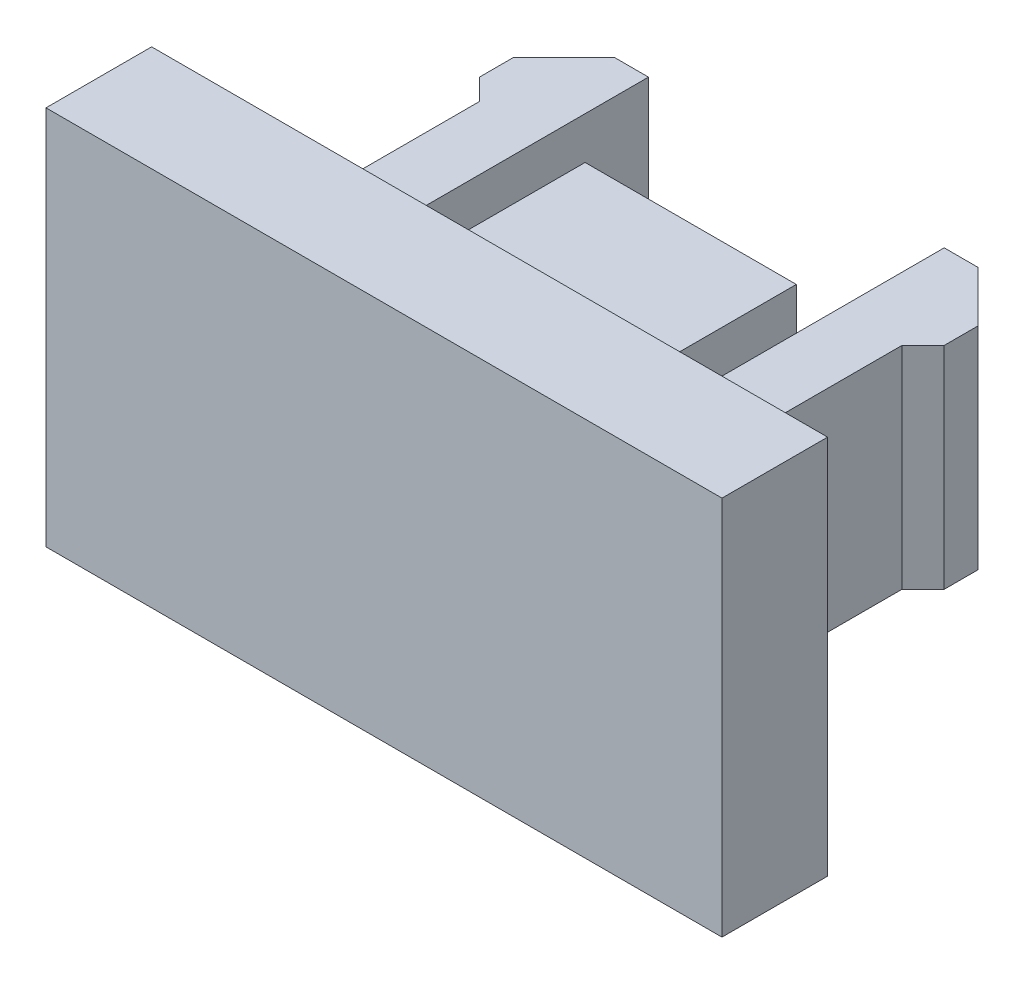
ISO-10303-21;
HEADER;
FILE_DESCRIPTION(('STEP AP214'),'2;1');
FILE_NAME('part.step','',(''),(''),'','','');
FILE_SCHEMA(('AUTOMOTIVE_DESIGN { 1 0 10303 214 1 1 1 1 }'));
ENDSEC;
DATA;
#1=APPLICATION_CONTEXT('core data for automotive mechanical design processes');
#2=APPLICATION_PROTOCOL_DEFINITION('international standard','automotive_design',2000,#1);
#3=PRODUCT_CONTEXT('',#1,'mechanical');
#4=PRODUCT('Part','Part','',(#3));
#5=PRODUCT_RELATED_PRODUCT_CATEGORY('part','',(#4));
#6=PRODUCT_DEFINITION_FORMATION('','',#4);
#7=PRODUCT_DEFINITION_CONTEXT('part definition',#1,'design');
#8=PRODUCT_DEFINITION('design','',#6,#7);
#9=PRODUCT_DEFINITION_SHAPE('','',#8);
#10=(LENGTH_UNIT() NAMED_UNIT(*) SI_UNIT(.MILLI.,.METRE.));
#11=(NAMED_UNIT(*) PLANE_ANGLE_UNIT() SI_UNIT($,.RADIAN.));
#12=(NAMED_UNIT(*) SI_UNIT($,.STERADIAN.) SOLID_ANGLE_UNIT());
#13=UNCERTAINTY_MEASURE_WITH_UNIT(LENGTH_MEASURE(1.E-05),#10,'distance_accuracy_value','');
#14=(GEOMETRIC_REPRESENTATION_CONTEXT(3) GLOBAL_UNCERTAINTY_ASSIGNED_CONTEXT((#13)) GLOBAL_UNIT_ASSIGNED_CONTEXT((#10,
#11,#12)) REPRESENTATION_CONTEXT('',''));
#15=CARTESIAN_POINT('',(0.,0.,0.));
#16=DIRECTION('',(0.,0.,1.));
#17=DIRECTION('',(1.,0.,0.));
#18=AXIS2_PLACEMENT_3D('',#15,#16,#17);
#19=CARTESIAN_POINT('',(0.,3.175,0.));
#20=DIRECTION('',(0.,1.,0.));
#21=DIRECTION('',(0.,0.,1.));
#22=AXIS2_PLACEMENT_3D('',#19,#20,#21);
#23=PLANE('',#22);
#24=DIRECTION('',(-1.,0.,0.));
#25=VECTOR('',#24,1.);
#26=CARTESIAN_POINT('',(0.,3.175,0.));
#27=LINE('',#26,#25);
#28=CARTESIAN_POINT('',(16.51,3.175,0.));
#29=VERTEX_POINT('',#28);
#30=CARTESIAN_POINT('',(14.605,3.175,0.));
#31=VERTEX_POINT('',#30);
#32=EDGE_CURVE('E310',#29,#31,#27,.T.);
#33=ORIENTED_EDGE('',*,*,#32,.F.);
#34=DIRECTION('',(0.,0.,-1.));
#35=VECTOR('',#34,1.);
#36=CARTESIAN_POINT('',(16.51,3.175,0.));
#37=LINE('',#36,#35);
#38=CARTESIAN_POINT('',(16.51,3.175,-6.0452));
#39=VERTEX_POINT('',#38);
#40=EDGE_CURVE('E359',#29,#39,#37,.T.);
#41=ORIENTED_EDGE('',*,*,#40,.T.);
#42=DIRECTION('',(0.707106781186547,0.,-0.707106781186548));
#43=VECTOR('',#42,1.);
#44=CARTESIAN_POINT('',(5.23240000000001,3.175,5.23240000000001));
#45=LINE('',#44,#43);
#46=CARTESIAN_POINT('',(17.145,3.175,-6.6802));
#47=VERTEX_POINT('',#46);
#48=EDGE_CURVE('E362',#39,#47,#45,.T.);
#49=ORIENTED_EDGE('',*,*,#48,.T.);
#50=DIRECTION('',(0.,0.,-1.));
#51=VECTOR('',#50,1.);
#52=CARTESIAN_POINT('',(17.145,3.175,0.));
#53=LINE('',#52,#51);
#54=CARTESIAN_POINT('',(17.145,3.175,-7.6962));
#55=VERTEX_POINT('',#54);
#56=EDGE_CURVE('E365',#47,#55,#53,.T.);
#57=ORIENTED_EDGE('',*,*,#56,.T.);
#58=DIRECTION('',(-0.707106781186548,0.,-0.707106781186547));
#59=VECTOR('',#58,1.);
#60=CARTESIAN_POINT('',(12.4206,3.175,-12.4206));
#61=LINE('',#60,#59);
#62=CARTESIAN_POINT('',(15.621,3.175,-9.2202));
#63=VERTEX_POINT('',#62);
#64=EDGE_CURVE('E368',#55,#63,#61,.T.);
#65=ORIENTED_EDGE('',*,*,#64,.T.);
#66=DIRECTION('',(-1.,0.,0.));
#67=VECTOR('',#66,1.);
#68=CARTESIAN_POINT('',(0.,3.175,-9.2202));
#69=LINE('',#68,#67);
#70=CARTESIAN_POINT('',(14.605,3.175,-9.2202));
#71=VERTEX_POINT('',#70);
#72=EDGE_CURVE('E371',#63,#71,#69,.T.);
#73=ORIENTED_EDGE('',*,*,#72,.T.);
#74=DIRECTION('',(0.,0.,1.));
#75=VECTOR('',#74,1.);
#76=CARTESIAN_POINT('',(14.605,3.175,0.));
#77=LINE('',#76,#75);
#78=EDGE_CURVE('E374',#71,#31,#77,.T.);
#79=ORIENTED_EDGE('',*,*,#78,.T.);
#80=EDGE_LOOP('',(#33,#41,#49,#57,#65,#73,#79));
#81=FACE_BOUND('',#80,.T.);
#82=ADVANCED_FACE('F47',(#81),#23,.T.);
#83=CARTESIAN_POINT('',(13.335,3.175,0.));
#84=VERTEX_POINT('',#83);
#85=CARTESIAN_POINT('',(6.985,3.175,0.));
#86=VERTEX_POINT('',#85);
#87=EDGE_CURVE('E311',#84,#86,#27,.T.);
#88=ORIENTED_EDGE('',*,*,#87,.F.);
#89=DIRECTION('',(0.,0.,1.));
#90=VECTOR('',#89,1.);
#91=CARTESIAN_POINT('',(13.335,3.175,-6.0452));
#92=LINE('',#91,#90);
#93=CARTESIAN_POINT('',(13.335,3.175,-6.0452));
#94=VERTEX_POINT('',#93);
#95=EDGE_CURVE('E328',#94,#84,#92,.T.);
#96=ORIENTED_EDGE('',*,*,#95,.F.);
#97=DIRECTION('',(1.,0.,0.));
#98=VECTOR('',#97,1.);
#99=CARTESIAN_POINT('',(0.,3.175,-6.0452));
#100=LINE('',#99,#98);
#101=CARTESIAN_POINT('',(6.985,3.175,-6.0452));
#102=VERTEX_POINT('',#101);
#103=EDGE_CURVE('E378',#102,#94,#100,.T.);
#104=ORIENTED_EDGE('',*,*,#103,.F.);
#105=DIRECTION('',(0.,0.,-1.));
#106=VECTOR('',#105,1.);
#107=CARTESIAN_POINT('',(6.985,3.175,-6.0452));
#108=LINE('',#107,#106);
#109=EDGE_CURVE('E324',#86,#102,#108,.T.);
#110=ORIENTED_EDGE('',*,*,#109,.F.);
#111=EDGE_LOOP('',(#88,#96,#104,#110));
#112=FACE_BOUND('',#111,.T.);
#113=ADVANCED_FACE('F402',(#112),#23,.T.);
#114=CARTESIAN_POINT('',(0.,-3.175,0.));
#115=DIRECTION('',(0.,1.,0.));
#116=DIRECTION('',(0.,0.,1.));
#117=AXIS2_PLACEMENT_3D('',#114,#115,#116);
#118=PLANE('',#117);
#119=DIRECTION('',(0.,0.,-1.));
#120=VECTOR('',#119,1.);
#121=CARTESIAN_POINT('',(16.51,-3.175,0.));
#122=LINE('',#121,#120);
#123=CARTESIAN_POINT('',(16.51,-3.175,0.));
#124=VERTEX_POINT('',#123);
#125=CARTESIAN_POINT('',(16.51,-3.175,-6.0452));
#126=VERTEX_POINT('',#125);
#127=EDGE_CURVE('E173',#124,#126,#122,.T.);
#128=ORIENTED_EDGE('',*,*,#127,.F.);
#129=DIRECTION('',(-1.,0.,0.));
#130=VECTOR('',#129,1.);
#131=CARTESIAN_POINT('',(0.,-3.175,0.));
#132=LINE('',#131,#130);
#133=CARTESIAN_POINT('',(14.605,-3.175,0.));
#134=VERTEX_POINT('',#133);
#135=EDGE_CURVE('E306',#124,#134,#132,.T.);
#136=ORIENTED_EDGE('',*,*,#135,.T.);
#137=DIRECTION('',(0.,0.,1.));
#138=VECTOR('',#137,1.);
#139=CARTESIAN_POINT('',(14.605,-3.175,0.));
#140=LINE('',#139,#138);
#141=CARTESIAN_POINT('',(14.605,-3.175,-9.2202));
#142=VERTEX_POINT('',#141);
#143=EDGE_CURVE('E189',#142,#134,#140,.T.);
#144=ORIENTED_EDGE('',*,*,#143,.F.);
#145=DIRECTION('',(-1.,0.,0.));
#146=VECTOR('',#145,1.);
#147=CARTESIAN_POINT('',(0.,-3.175,-9.2202));
#148=LINE('',#147,#146);
#149=CARTESIAN_POINT('',(15.621,-3.175,-9.2202));
#150=VERTEX_POINT('',#149);
#151=EDGE_CURVE('E186',#150,#142,#148,.T.);
#152=ORIENTED_EDGE('',*,*,#151,.F.);
#153=DIRECTION('',(-0.707106781186548,0.,-0.707106781186547));
#154=VECTOR('',#153,1.);
#155=CARTESIAN_POINT('',(12.4206,-3.175,-12.4206));
#156=LINE('',#155,#154);
#157=CARTESIAN_POINT('',(17.145,-3.175,-7.6962));
#158=VERTEX_POINT('',#157);
#159=EDGE_CURVE('E183',#158,#150,#156,.T.);
#160=ORIENTED_EDGE('',*,*,#159,.F.);
#161=DIRECTION('',(0.,0.,-1.));
#162=VECTOR('',#161,1.);
#163=CARTESIAN_POINT('',(17.145,-3.175,0.));
#164=LINE('',#163,#162);
#165=CARTESIAN_POINT('',(17.145,-3.175,-6.6802));
#166=VERTEX_POINT('',#165);
#167=EDGE_CURVE('E180',#166,#158,#164,.T.);
#168=ORIENTED_EDGE('',*,*,#167,.F.);
#169=DIRECTION('',(0.707106781186547,0.,-0.707106781186548));
#170=VECTOR('',#169,1.);
#171=CARTESIAN_POINT('',(5.23240000000001,-3.175,5.23240000000001));
#172=LINE('',#171,#170);
#173=EDGE_CURVE('E177',#126,#166,#172,.T.);
#174=ORIENTED_EDGE('',*,*,#173,.F.);
#175=EDGE_LOOP('',(#128,#136,#144,#152,#160,#168,#174));
#176=FACE_BOUND('',#175,.T.);
#177=ADVANCED_FACE('F410',(#176),#118,.F.);
#178=DIRECTION('',(0.,0.,1.));
#179=VECTOR('',#178,1.);
#180=CARTESIAN_POINT('',(13.335,-3.175,-6.0452));
#181=LINE('',#180,#179);
#182=CARTESIAN_POINT('',(13.335,-3.175,-6.0452));
#183=VERTEX_POINT('',#182);
#184=CARTESIAN_POINT('',(13.335,-3.175,0.));
#185=VERTEX_POINT('',#184);
#186=EDGE_CURVE('E343',#183,#185,#181,.T.);
#187=ORIENTED_EDGE('',*,*,#186,.T.);
#188=CARTESIAN_POINT('',(6.985,-3.175,0.));
#189=VERTEX_POINT('',#188);
#190=EDGE_CURVE('E312',#185,#189,#132,.T.);
#191=ORIENTED_EDGE('',*,*,#190,.T.);
#192=DIRECTION('',(0.,0.,-1.));
#193=VECTOR('',#192,1.);
#194=CARTESIAN_POINT('',(6.985,-3.175,-6.0452));
#195=LINE('',#194,#193);
#196=CARTESIAN_POINT('',(6.985,-3.175,-6.0452));
#197=VERTEX_POINT('',#196);
#198=EDGE_CURVE('E319',#189,#197,#195,.T.);
#199=ORIENTED_EDGE('',*,*,#198,.T.);
#200=DIRECTION('',(1.,0.,0.));
#201=VECTOR('',#200,1.);
#202=CARTESIAN_POINT('',(0.,-3.175,-6.0452));
#203=LINE('',#202,#201);
#204=EDGE_CURVE('E193',#197,#183,#203,.T.);
#205=ORIENTED_EDGE('',*,*,#204,.T.);
#206=EDGE_LOOP('',(#187,#191,#199,#205));
#207=FACE_BOUND('',#206,.T.);
#208=ADVANCED_FACE('F416',(#207),#118,.F.);
#209=CARTESIAN_POINT('',(3.81,3.175,0.));
#210=DIRECTION('',(-1.,0.,0.));
#211=DIRECTION('',(0.,0.,1.));
#212=AXIS2_PLACEMENT_3D('',#209,#210,#211);
#213=PLANE('',#212);
#214=DIRECTION('',(0.,0.,-1.));
#215=VECTOR('',#214,1.);
#216=CARTESIAN_POINT('',(3.81,-3.175,0.));
#217=LINE('',#216,#215);
#218=CARTESIAN_POINT('',(3.81,-3.175,0.));
#219=VERTEX_POINT('',#218);
#220=CARTESIAN_POINT('',(3.81,-3.175,-6.0452));
#221=VERTEX_POINT('',#220);
#222=EDGE_CURVE('E170',#219,#221,#217,.T.);
#223=ORIENTED_EDGE('',*,*,#222,.F.);
#224=DIRECTION('',(0.,-1.,0.));
#225=VECTOR('',#224,1.);
#226=CARTESIAN_POINT('',(3.81,3.175,0.));
#227=LINE('',#226,#225);
#228=CARTESIAN_POINT('',(3.81,3.175,0.));
#229=VERTEX_POINT('',#228);
#230=EDGE_CURVE('E11',#229,#219,#227,.T.);
#231=ORIENTED_EDGE('',*,*,#230,.F.);
#232=DIRECTION('',(0.,0.,-1.));
#233=VECTOR('',#232,1.);
#234=CARTESIAN_POINT('',(3.81,3.175,0.));
#235=LINE('',#234,#233);
#236=CARTESIAN_POINT('',(3.81,3.175,-6.0452));
#237=VERTEX_POINT('',#236);
#238=EDGE_CURVE('E214',#229,#237,#235,.T.);
#239=ORIENTED_EDGE('',*,*,#238,.T.);
#240=DIRECTION('',(0.,-1.,0.));
#241=VECTOR('',#240,1.);
#242=CARTESIAN_POINT('',(3.81,3.175,-6.0452));
#243=LINE('',#242,#241);
#244=EDGE_CURVE('E65',#237,#221,#243,.T.);
#245=ORIENTED_EDGE('',*,*,#244,.T.);
#246=EDGE_LOOP('',(#223,#231,#239,#245));
#247=FACE_BOUND('',#246,.T.);
#248=ADVANCED_FACE('F49',(#247),#213,.T.);
#249=CARTESIAN_POINT('',(0.,3.175,0.));
#250=DIRECTION('',(1.,0.,0.));
#251=DIRECTION('',(0.,0.,-1.));
#252=AXIS2_PLACEMENT_3D('',#249,#250,#251);
#253=PLANE('',#252);
#254=DIRECTION('',(0.,-1.,0.));
#255=VECTOR('',#254,1.);
#256=CARTESIAN_POINT('',(0.,3.175,0.));
#257=LINE('',#256,#255);
#258=CARTESIAN_POINT('',(0.,5.715,0.));
#259=VERTEX_POINT('',#258);
#260=CARTESIAN_POINT('',(0.,-5.715,0.));
#261=VERTEX_POINT('',#260);
#262=EDGE_CURVE('E57',#259,#261,#257,.T.);
#263=ORIENTED_EDGE('',*,*,#262,.T.);
#264=DIRECTION('',(0.,0.,1.));
#265=VECTOR('',#264,1.);
#266=CARTESIAN_POINT('',(0.,-5.715,0.));
#267=LINE('',#266,#265);
#268=CARTESIAN_POINT('',(0.,-5.715,3.175));
#269=VERTEX_POINT('',#268);
#270=EDGE_CURVE('E270',#261,#269,#267,.T.);
#271=ORIENTED_EDGE('',*,*,#270,.T.);
#272=DIRECTION('',(0.,-1.,0.));
#273=VECTOR('',#272,1.);
#274=CARTESIAN_POINT('',(0.,3.175,3.175));
#275=LINE('',#274,#273);
#276=CARTESIAN_POINT('',(0.,5.715,3.175));
#277=VERTEX_POINT('',#276);
#278=EDGE_CURVE('E256',#277,#269,#275,.T.);
#279=ORIENTED_EDGE('',*,*,#278,.F.);
#280=DIRECTION('',(0.,0.,1.));
#281=VECTOR('',#280,1.);
#282=CARTESIAN_POINT('',(0.,5.715,0.));
#283=LINE('',#282,#281);
#284=EDGE_CURVE('E274',#259,#277,#283,.T.);
#285=ORIENTED_EDGE('',*,*,#284,.F.);
#286=EDGE_LOOP('',(#263,#271,#279,#285));
#287=FACE_BOUND('',#286,.T.);
#288=ADVANCED_FACE('F267',(#287),#253,.F.);
#289=CARTESIAN_POINT('',(0.,3.175,3.175));
#290=DIRECTION('',(0.,0.,-1.));
#291=DIRECTION('',(-1.,0.,0.));
#292=AXIS2_PLACEMENT_3D('',#289,#290,#291);
#293=PLANE('',#292);
#294=ORIENTED_EDGE('',*,*,#278,.T.);
#295=DIRECTION('',(1.,0.,0.));
#296=VECTOR('',#295,1.);
#297=CARTESIAN_POINT('',(0.,-5.715,3.175));
#298=LINE('',#297,#296);
#299=CARTESIAN_POINT('',(20.32,-5.715,3.175));
#300=VERTEX_POINT('',#299);
#301=EDGE_CURVE('E287',#269,#300,#298,.T.);
#302=ORIENTED_EDGE('',*,*,#301,.T.);
#303=DIRECTION('',(0.,-1.,0.));
#304=VECTOR('',#303,1.);
#305=CARTESIAN_POINT('',(20.32,3.175,3.175));
#306=LINE('',#305,#304);
#307=CARTESIAN_POINT('',(20.32,5.715,3.175));
#308=VERTEX_POINT('',#307);
#309=EDGE_CURVE('E252',#308,#300,#306,.T.);
#310=ORIENTED_EDGE('',*,*,#309,.F.);
#311=DIRECTION('',(1.,0.,0.));
#312=VECTOR('',#311,1.);
#313=CARTESIAN_POINT('',(0.,5.715,3.175));
#314=LINE('',#313,#312);
#315=EDGE_CURVE('E474',#277,#308,#314,.T.);
#316=ORIENTED_EDGE('',*,*,#315,.F.);
#317=EDGE_LOOP('',(#294,#302,#310,#316));
#318=FACE_BOUND('',#317,.T.);
#319=ADVANCED_FACE('F518',(#318),#293,.F.);
#320=CARTESIAN_POINT('',(20.32,3.175,0.));
#321=DIRECTION('',(-1.,0.,0.));
#322=DIRECTION('',(0.,0.,1.));
#323=AXIS2_PLACEMENT_3D('',#320,#321,#322);
#324=PLANE('',#323);
#325=ORIENTED_EDGE('',*,*,#309,.T.);
#326=DIRECTION('',(0.,0.,-1.));
#327=VECTOR('',#326,1.);
#328=CARTESIAN_POINT('',(20.32,-5.715,0.));
#329=LINE('',#328,#327);
#330=CARTESIAN_POINT('',(20.32,-5.715,0.));
#331=VERTEX_POINT('',#330);
#332=EDGE_CURVE('E302',#300,#331,#329,.T.);
#333=ORIENTED_EDGE('',*,*,#332,.T.);
#334=DIRECTION('',(0.,-1.,0.));
#335=VECTOR('',#334,1.);
#336=CARTESIAN_POINT('',(20.32,3.175,0.));
#337=LINE('',#336,#335);
#338=CARTESIAN_POINT('',(20.32,5.715,0.));
#339=VERTEX_POINT('',#338);
#340=EDGE_CURVE('E248',#339,#331,#337,.T.);
#341=ORIENTED_EDGE('',*,*,#340,.F.);
#342=DIRECTION('',(0.,0.,-1.));
#343=VECTOR('',#342,1.);
#344=CARTESIAN_POINT('',(20.32,5.715,0.));
#345=LINE('',#344,#343);
#346=EDGE_CURVE('E297',#308,#339,#345,.T.);
#347=ORIENTED_EDGE('',*,*,#346,.F.);
#348=EDGE_LOOP('',(#325,#333,#341,#347));
#349=FACE_BOUND('',#348,.T.);
#350=ADVANCED_FACE('F509',(#349),#324,.F.);
#351=CARTESIAN_POINT('',(0.,3.175,0.));
#352=DIRECTION('',(0.,0.,-1.));
#353=DIRECTION('',(-1.,0.,0.));
#354=AXIS2_PLACEMENT_3D('',#351,#352,#353);
#355=PLANE('',#354);
#356=DIRECTION('',(1.,0.,0.));
#357=VECTOR('',#356,1.);
#358=CARTESIAN_POINT('',(0.,5.715,0.));
#359=LINE('',#358,#357);
#360=EDGE_CURVE('E305',#259,#339,#359,.T.);
#361=ORIENTED_EDGE('',*,*,#360,.T.);
#362=ORIENTED_EDGE('',*,*,#340,.T.);
#363=DIRECTION('',(1.,0.,0.));
#364=VECTOR('',#363,1.);
#365=CARTESIAN_POINT('',(0.,-5.715,0.));
#366=LINE('',#365,#364);
#367=EDGE_CURVE('E285',#261,#331,#366,.T.);
#368=ORIENTED_EDGE('',*,*,#367,.F.);
#369=ORIENTED_EDGE('',*,*,#262,.F.);
#370=EDGE_LOOP('',(#361,#362,#368,#369));
#371=FACE_BOUND('',#370,.T.);
#372=ORIENTED_EDGE('',*,*,#32,.T.);
#373=DIRECTION('',(0.,1.,0.));
#374=VECTOR('',#373,1.);
#375=CARTESIAN_POINT('',(14.605,-3.175,0.));
#376=LINE('',#375,#374);
#377=EDGE_CURVE('E317',#134,#31,#376,.T.);
#378=ORIENTED_EDGE('',*,*,#377,.F.);
#379=ORIENTED_EDGE('',*,*,#135,.F.);
#380=DIRECTION('',(0.,-1.,0.));
#381=VECTOR('',#380,1.);
#382=CARTESIAN_POINT('',(16.51,3.175,0.));
#383=LINE('',#382,#381);
#384=EDGE_CURVE('E244',#29,#124,#383,.T.);
#385=ORIENTED_EDGE('',*,*,#384,.F.);
#386=EDGE_LOOP('',(#372,#378,#379,#385));
#387=FACE_BOUND('',#386,.T.);
#388=ORIENTED_EDGE('',*,*,#87,.T.);
#389=DIRECTION('',(0.,1.,0.));
#390=VECTOR('',#389,1.);
#391=CARTESIAN_POINT('',(6.985,-3.175,0.));
#392=LINE('',#391,#390);
#393=EDGE_CURVE('E332',#189,#86,#392,.T.);
#394=ORIENTED_EDGE('',*,*,#393,.F.);
#395=ORIENTED_EDGE('',*,*,#190,.F.);
#396=DIRECTION('',(0.,1.,0.));
#397=VECTOR('',#396,1.);
#398=CARTESIAN_POINT('',(13.335,-3.175,0.));
#399=LINE('',#398,#397);
#400=EDGE_CURVE('E344',#185,#84,#399,.T.);
#401=ORIENTED_EDGE('',*,*,#400,.T.);
#402=EDGE_LOOP('',(#388,#394,#395,#401));
#403=FACE_BOUND('',#402,.T.);
#404=DIRECTION('',(0.,1.,0.));
#405=VECTOR('',#404,1.);
#406=CARTESIAN_POINT('',(5.715,-3.175,0.));
#407=LINE('',#406,#405);
#408=CARTESIAN_POINT('',(5.715,-3.175,0.));
#409=VERTEX_POINT('',#408);
#410=CARTESIAN_POINT('',(5.715,3.175,0.));
#411=VERTEX_POINT('',#410);
#412=EDGE_CURVE('E323',#409,#411,#407,.T.);
#413=ORIENTED_EDGE('',*,*,#412,.T.);
#414=EDGE_CURVE('E318',#411,#229,#27,.T.);
#415=ORIENTED_EDGE('',*,*,#414,.T.);
#416=ORIENTED_EDGE('',*,*,#230,.T.);
#417=EDGE_CURVE('E313',#409,#219,#132,.T.);
#418=ORIENTED_EDGE('',*,*,#417,.F.);
#419=EDGE_LOOP('',(#413,#415,#416,#418));
#420=FACE_BOUND('',#419,.T.);
#421=ADVANCED_FACE('F290',(#371,#387,#403,#420),#355,.T.);
#422=CARTESIAN_POINT('',(16.51,3.175,0.));
#423=DIRECTION('',(-1.,0.,0.));
#424=DIRECTION('',(0.,0.,1.));
#425=AXIS2_PLACEMENT_3D('',#422,#423,#424);
#426=PLANE('',#425);
#427=ORIENTED_EDGE('',*,*,#127,.T.);
#428=DIRECTION('',(0.,-1.,0.));
#429=VECTOR('',#428,1.);
#430=CARTESIAN_POINT('',(16.51,3.175,-6.0452));
#431=LINE('',#430,#429);
#432=EDGE_CURVE('E240',#39,#126,#431,.T.);
#433=ORIENTED_EDGE('',*,*,#432,.F.);
#434=ORIENTED_EDGE('',*,*,#40,.F.);
#435=ORIENTED_EDGE('',*,*,#384,.T.);
#436=EDGE_LOOP('',(#427,#433,#434,#435));
#437=FACE_BOUND('',#436,.T.);
#438=ADVANCED_FACE('F508',(#437),#426,.F.);
#439=CARTESIAN_POINT('',(5.23240000000001,3.175,5.23240000000001));
#440=DIRECTION('',(-0.707106781186548,0.,-0.707106781186547));
#441=DIRECTION('',(-0.707106781186547,0.,0.707106781186548));
#442=AXIS2_PLACEMENT_3D('',#439,#440,#441);
#443=PLANE('',#442);
#444=ORIENTED_EDGE('',*,*,#173,.T.);
#445=DIRECTION('',(0.,-1.,0.));
#446=VECTOR('',#445,1.);
#447=CARTESIAN_POINT('',(17.145,3.175,-6.6802));
#448=LINE('',#447,#446);
#449=EDGE_CURVE('E236',#47,#166,#448,.T.);
#450=ORIENTED_EDGE('',*,*,#449,.F.);
#451=ORIENTED_EDGE('',*,*,#48,.F.);
#452=ORIENTED_EDGE('',*,*,#432,.T.);
#453=EDGE_LOOP('',(#444,#450,#451,#452));
#454=FACE_BOUND('',#453,.T.);
#455=ADVANCED_FACE('F515',(#454),#443,.F.);
#456=CARTESIAN_POINT('',(17.145,3.175,0.));
#457=DIRECTION('',(-1.,0.,0.));
#458=DIRECTION('',(0.,0.,1.));
#459=AXIS2_PLACEMENT_3D('',#456,#457,#458);
#460=PLANE('',#459);
#461=ORIENTED_EDGE('',*,*,#167,.T.);
#462=DIRECTION('',(0.,-1.,0.));
#463=VECTOR('',#462,1.);
#464=CARTESIAN_POINT('',(17.145,3.175,-7.6962));
#465=LINE('',#464,#463);
#466=EDGE_CURVE('E232',#55,#158,#465,.T.);
#467=ORIENTED_EDGE('',*,*,#466,.F.);
#468=ORIENTED_EDGE('',*,*,#56,.F.);
#469=ORIENTED_EDGE('',*,*,#449,.T.);
#470=EDGE_LOOP('',(#461,#467,#468,#469));
#471=FACE_BOUND('',#470,.T.);
#472=ADVANCED_FACE('F680',(#471),#460,.F.);
#473=CARTESIAN_POINT('',(12.4206,3.175,-12.4206));
#474=DIRECTION('',(-0.707106781186547,0.,0.707106781186548));
#475=DIRECTION('',(0.707106781186548,0.,0.707106781186547));
#476=AXIS2_PLACEMENT_3D('',#473,#474,#475);
#477=PLANE('',#476);
#478=ORIENTED_EDGE('',*,*,#159,.T.);
#479=DIRECTION('',(0.,-1.,0.));
#480=VECTOR('',#479,1.);
#481=CARTESIAN_POINT('',(15.621,3.175,-9.2202));
#482=LINE('',#481,#480);
#483=EDGE_CURVE('E228',#63,#150,#482,.T.);
#484=ORIENTED_EDGE('',*,*,#483,.F.);
#485=ORIENTED_EDGE('',*,*,#64,.F.);
#486=ORIENTED_EDGE('',*,*,#466,.T.);
#487=EDGE_LOOP('',(#478,#484,#485,#486));
#488=FACE_BOUND('',#487,.T.);
#489=ADVANCED_FACE('F671',(#488),#477,.F.);
#490=CARTESIAN_POINT('',(0.,3.175,-9.2202));
#491=DIRECTION('',(0.,0.,1.));
#492=DIRECTION('',(1.,0.,0.));
#493=AXIS2_PLACEMENT_3D('',#490,#491,#492);
#494=PLANE('',#493);
#495=ORIENTED_EDGE('',*,*,#151,.T.);
#496=DIRECTION('',(0.,-1.,0.));
#497=VECTOR('',#496,1.);
#498=CARTESIAN_POINT('',(14.605,3.175,-9.2202));
#499=LINE('',#498,#497);
#500=EDGE_CURVE('E224',#71,#142,#499,.T.);
#501=ORIENTED_EDGE('',*,*,#500,.F.);
#502=ORIENTED_EDGE('',*,*,#72,.F.);
#503=ORIENTED_EDGE('',*,*,#483,.T.);
#504=EDGE_LOOP('',(#495,#501,#502,#503));
#505=FACE_BOUND('',#504,.T.);
#506=ADVANCED_FACE('F608',(#505),#494,.F.);
#507=CARTESIAN_POINT('',(14.605,3.175,0.));
#508=DIRECTION('',(1.,0.,0.));
#509=DIRECTION('',(0.,0.,-1.));
#510=AXIS2_PLACEMENT_3D('',#507,#508,#509);
#511=PLANE('',#510);
#512=ORIENTED_EDGE('',*,*,#143,.T.);
#513=ORIENTED_EDGE('',*,*,#377,.T.);
#514=ORIENTED_EDGE('',*,*,#78,.F.);
#515=ORIENTED_EDGE('',*,*,#500,.T.);
#516=EDGE_LOOP('',(#512,#513,#514,#515));
#517=FACE_BOUND('',#516,.T.);
#518=ADVANCED_FACE('F604',(#517),#511,.F.);
#519=CARTESIAN_POINT('',(0.,3.175,-6.0452));
#520=DIRECTION('',(0.,0.,-1.));
#521=DIRECTION('',(-1.,0.,0.));
#522=AXIS2_PLACEMENT_3D('',#519,#520,#521);
#523=PLANE('',#522);
#524=DIRECTION('',(0.,1.,0.));
#525=VECTOR('',#524,1.);
#526=CARTESIAN_POINT('',(6.985,-3.175,-6.0452));
#527=LINE('',#526,#525);
#528=EDGE_CURVE('E174',#197,#102,#527,.T.);
#529=ORIENTED_EDGE('',*,*,#528,.T.);
#530=ORIENTED_EDGE('',*,*,#103,.T.);
#531=DIRECTION('',(0.,1.,0.));
#532=VECTOR('',#531,1.);
#533=CARTESIAN_POINT('',(13.335,-3.175,-6.0452));
#534=LINE('',#533,#532);
#535=EDGE_CURVE('E339',#183,#94,#534,.T.);
#536=ORIENTED_EDGE('',*,*,#535,.F.);
#537=ORIENTED_EDGE('',*,*,#204,.F.);
#538=EDGE_LOOP('',(#529,#530,#536,#537));
#539=FACE_BOUND('',#538,.T.);
#540=ADVANCED_FACE('F446',(#539),#523,.T.);
#541=CARTESIAN_POINT('',(5.715,3.175,0.));
#542=DIRECTION('',(1.,0.,0.));
#543=DIRECTION('',(0.,0.,-1.));
#544=AXIS2_PLACEMENT_3D('',#541,#542,#543);
#545=PLANE('',#544);
#546=DIRECTION('',(0.,0.,1.));
#547=VECTOR('',#546,1.);
#548=CARTESIAN_POINT('',(5.715,-3.175,0.));
#549=LINE('',#548,#547);
#550=CARTESIAN_POINT('',(5.715,-3.175,-9.2202));
#551=VERTEX_POINT('',#550);
#552=EDGE_CURVE('E197',#551,#409,#549,.T.);
#553=ORIENTED_EDGE('',*,*,#552,.F.);
#554=DIRECTION('',(0.,-1.,0.));
#555=VECTOR('',#554,1.);
#556=CARTESIAN_POINT('',(5.715,3.175,-9.2202));
#557=LINE('',#556,#555);
#558=CARTESIAN_POINT('',(5.715,3.175,-9.2202));
#559=VERTEX_POINT('',#558);
#560=EDGE_CURVE('E221',#559,#551,#557,.T.);
#561=ORIENTED_EDGE('',*,*,#560,.F.);
#562=DIRECTION('',(0.,0.,1.));
#563=VECTOR('',#562,1.);
#564=CARTESIAN_POINT('',(5.715,3.175,0.));
#565=LINE('',#564,#563);
#566=EDGE_CURVE('E382',#559,#411,#565,.T.);
#567=ORIENTED_EDGE('',*,*,#566,.T.);
#568=ORIENTED_EDGE('',*,*,#412,.F.);
#569=EDGE_LOOP('',(#553,#561,#567,#568));
#570=FACE_BOUND('',#569,.T.);
#571=ADVANCED_FACE('F506',(#570),#545,.T.);
#572=CARTESIAN_POINT('',(0.,3.175,-9.2202));
#573=DIRECTION('',(0.,0.,-1.));
#574=DIRECTION('',(-1.,0.,0.));
#575=AXIS2_PLACEMENT_3D('',#572,#573,#574);
#576=PLANE('',#575);
#577=DIRECTION('',(1.,0.,0.));
#578=VECTOR('',#577,1.);
#579=CARTESIAN_POINT('',(0.,-3.175,-9.2202));
#580=LINE('',#579,#578);
#581=CARTESIAN_POINT('',(4.699,-3.175,-9.2202));
#582=VERTEX_POINT('',#581);
#583=EDGE_CURVE('E201',#582,#551,#580,.T.);
#584=ORIENTED_EDGE('',*,*,#583,.F.);
#585=DIRECTION('',(0.,-1.,0.));
#586=VECTOR('',#585,1.);
#587=CARTESIAN_POINT('',(4.699,3.175,-9.2202));
#588=LINE('',#587,#586);
#589=CARTESIAN_POINT('',(4.699,3.175,-9.2202));
#590=VERTEX_POINT('',#589);
#591=EDGE_CURVE('E148',#590,#582,#588,.T.);
#592=ORIENTED_EDGE('',*,*,#591,.F.);
#593=DIRECTION('',(1.,0.,0.));
#594=VECTOR('',#593,1.);
#595=CARTESIAN_POINT('',(0.,3.175,-9.2202));
#596=LINE('',#595,#594);
#597=EDGE_CURVE('E159',#590,#559,#596,.T.);
#598=ORIENTED_EDGE('',*,*,#597,.T.);
#599=ORIENTED_EDGE('',*,*,#560,.T.);
#600=EDGE_LOOP('',(#584,#592,#598,#599));
#601=FACE_BOUND('',#600,.T.);
#602=ADVANCED_FACE('F388',(#601),#576,.T.);
#603=CARTESIAN_POINT('',(-2.2606,3.175,-2.2606));
#604=DIRECTION('',(-0.707106781186548,0.,-0.707106781186548));
#605=DIRECTION('',(-0.707106781186548,0.,0.707106781186548));
#606=AXIS2_PLACEMENT_3D('',#603,#604,#605);
#607=PLANE('',#606);
#608=DIRECTION('',(0.707106781186548,0.,-0.707106781186548));
#609=VECTOR('',#608,1.);
#610=CARTESIAN_POINT('',(-2.2606,-3.175,-2.2606));
#611=LINE('',#610,#609);
#612=CARTESIAN_POINT('',(3.175,-3.175,-7.6962));
#613=VERTEX_POINT('',#612);
#614=EDGE_CURVE('E143',#613,#582,#611,.T.);
#615=ORIENTED_EDGE('',*,*,#614,.F.);
#616=DIRECTION('',(0.,-1.,0.));
#617=VECTOR('',#616,1.);
#618=CARTESIAN_POINT('',(3.175,3.175,-7.6962));
#619=LINE('',#618,#617);
#620=CARTESIAN_POINT('',(3.175,3.175,-7.6962));
#621=VERTEX_POINT('',#620);
#622=EDGE_CURVE('E138',#621,#613,#619,.T.);
#623=ORIENTED_EDGE('',*,*,#622,.F.);
#624=DIRECTION('',(0.707106781186548,0.,-0.707106781186548));
#625=VECTOR('',#624,1.);
#626=CARTESIAN_POINT('',(-2.2606,3.175,-2.2606));
#627=LINE('',#626,#625);
#628=EDGE_CURVE('E141',#621,#590,#627,.T.);
#629=ORIENTED_EDGE('',*,*,#628,.T.);
#630=ORIENTED_EDGE('',*,*,#591,.T.);
#631=EDGE_LOOP('',(#615,#623,#629,#630));
#632=FACE_BOUND('',#631,.T.);
#633=ADVANCED_FACE('F140',(#632),#607,.T.);
#634=CARTESIAN_POINT('',(3.175,3.175,0.));
#635=DIRECTION('',(-1.,0.,0.));
#636=DIRECTION('',(0.,0.,1.));
#637=AXIS2_PLACEMENT_3D('',#634,#635,#636);
#638=PLANE('',#637);
#639=DIRECTION('',(0.,0.,-1.));
#640=VECTOR('',#639,1.);
#641=CARTESIAN_POINT('',(3.175,-3.175,0.));
#642=LINE('',#641,#640);
#643=CARTESIAN_POINT('',(3.175,-3.175,-6.6802));
#644=VERTEX_POINT('',#643);
#645=EDGE_CURVE('E207',#644,#613,#642,.T.);
#646=ORIENTED_EDGE('',*,*,#645,.F.);
#647=DIRECTION('',(0.,-1.,0.));
#648=VECTOR('',#647,1.);
#649=CARTESIAN_POINT('',(3.175,3.175,-6.6802));
#650=LINE('',#649,#648);
#651=CARTESIAN_POINT('',(3.175,3.175,-6.6802));
#652=VERTEX_POINT('',#651);
#653=EDGE_CURVE('E98',#652,#644,#650,.T.);
#654=ORIENTED_EDGE('',*,*,#653,.F.);
#655=DIRECTION('',(0.,0.,-1.));
#656=VECTOR('',#655,1.);
#657=CARTESIAN_POINT('',(3.175,3.175,0.));
#658=LINE('',#657,#656);
#659=EDGE_CURVE('E156',#652,#621,#658,.T.);
#660=ORIENTED_EDGE('',*,*,#659,.T.);
#661=ORIENTED_EDGE('',*,*,#622,.T.);
#662=EDGE_LOOP('',(#646,#654,#660,#661));
#663=FACE_BOUND('',#662,.T.);
#664=ADVANCED_FACE('F162',(#663),#638,.T.);
#665=CARTESIAN_POINT('',(4.9276,3.175,-4.9276));
#666=DIRECTION('',(-0.707106781186548,0.,0.707106781186548));
#667=DIRECTION('',(0.707106781186548,0.,0.707106781186548));
#668=AXIS2_PLACEMENT_3D('',#665,#666,#667);
#669=PLANE('',#668);
#670=DIRECTION('',(-0.707106781186548,0.,-0.707106781186548));
#671=VECTOR('',#670,1.);
#672=CARTESIAN_POINT('',(4.9276,-3.175,-4.9276));
#673=LINE('',#672,#671);
#674=EDGE_CURVE('E210',#221,#644,#673,.T.);
#675=ORIENTED_EDGE('',*,*,#674,.F.);
#676=ORIENTED_EDGE('',*,*,#244,.F.);
#677=DIRECTION('',(-0.707106781186548,0.,-0.707106781186548));
#678=VECTOR('',#677,1.);
#679=CARTESIAN_POINT('',(4.9276,3.175,-4.9276));
#680=LINE('',#679,#678);
#681=EDGE_CURVE('E164',#237,#652,#680,.T.);
#682=ORIENTED_EDGE('',*,*,#681,.T.);
#683=ORIENTED_EDGE('',*,*,#653,.T.);
#684=EDGE_LOOP('',(#675,#676,#682,#683));
#685=FACE_BOUND('',#684,.T.);
#686=ADVANCED_FACE('F393',(#685),#669,.T.);
#687=ORIENTED_EDGE('',*,*,#414,.F.);
#688=ORIENTED_EDGE('',*,*,#566,.F.);
#689=ORIENTED_EDGE('',*,*,#597,.F.);
#690=ORIENTED_EDGE('',*,*,#628,.F.);
#691=ORIENTED_EDGE('',*,*,#659,.F.);
#692=ORIENTED_EDGE('',*,*,#681,.F.);
#693=ORIENTED_EDGE('',*,*,#238,.F.);
#694=EDGE_LOOP('',(#687,#688,#689,#690,#691,#692,#693));
#695=FACE_BOUND('',#694,.T.);
#696=ADVANCED_FACE('F154',(#695),#23,.T.);
#697=ORIENTED_EDGE('',*,*,#552,.T.);
#698=ORIENTED_EDGE('',*,*,#417,.T.);
#699=ORIENTED_EDGE('',*,*,#222,.T.);
#700=ORIENTED_EDGE('',*,*,#674,.T.);
#701=ORIENTED_EDGE('',*,*,#645,.T.);
#702=ORIENTED_EDGE('',*,*,#614,.T.);
#703=ORIENTED_EDGE('',*,*,#583,.T.);
#704=EDGE_LOOP('',(#697,#698,#699,#700,#701,#702,#703));
#705=FACE_BOUND('',#704,.T.);
#706=ADVANCED_FACE('F391',(#705),#118,.F.);
#707=CARTESIAN_POINT('',(13.335,-3.175,-6.0452));
#708=DIRECTION('',(-1.,0.,0.));
#709=DIRECTION('',(0.,0.,1.));
#710=AXIS2_PLACEMENT_3D('',#707,#708,#709);
#711=PLANE('',#710);
#712=ORIENTED_EDGE('',*,*,#95,.T.);
#713=ORIENTED_EDGE('',*,*,#400,.F.);
#714=ORIENTED_EDGE('',*,*,#186,.F.);
#715=ORIENTED_EDGE('',*,*,#535,.T.);
#716=EDGE_LOOP('',(#712,#713,#714,#715));
#717=FACE_BOUND('',#716,.T.);
#718=ADVANCED_FACE('F413',(#717),#711,.F.);
#719=CARTESIAN_POINT('',(6.985,-3.175,-6.0452));
#720=DIRECTION('',(1.,0.,0.));
#721=DIRECTION('',(0.,0.,-1.));
#722=AXIS2_PLACEMENT_3D('',#719,#720,#721);
#723=PLANE('',#722);
#724=ORIENTED_EDGE('',*,*,#109,.T.);
#725=ORIENTED_EDGE('',*,*,#528,.F.);
#726=ORIENTED_EDGE('',*,*,#198,.F.);
#727=ORIENTED_EDGE('',*,*,#393,.T.);
#728=EDGE_LOOP('',(#724,#725,#726,#727));
#729=FACE_BOUND('',#728,.T.);
#730=ADVANCED_FACE('F420',(#729),#723,.F.);
#731=CARTESIAN_POINT('',(0.,-5.715,0.));
#732=DIRECTION('',(0.,1.,0.));
#733=DIRECTION('',(0.,0.,1.));
#734=AXIS2_PLACEMENT_3D('',#731,#732,#733);
#735=PLANE('',#734);
#736=ORIENTED_EDGE('',*,*,#367,.T.);
#737=ORIENTED_EDGE('',*,*,#332,.F.);
#738=ORIENTED_EDGE('',*,*,#301,.F.);
#739=ORIENTED_EDGE('',*,*,#270,.F.);
#740=EDGE_LOOP('',(#736,#737,#738,#739));
#741=FACE_BOUND('',#740,.T.);
#742=ADVANCED_FACE('F282',(#741),#735,.F.);
#743=CARTESIAN_POINT('',(0.,5.715,0.));
#744=DIRECTION('',(0.,1.,0.));
#745=DIRECTION('',(0.,0.,1.));
#746=AXIS2_PLACEMENT_3D('',#743,#744,#745);
#747=PLANE('',#746);
#748=ORIENTED_EDGE('',*,*,#360,.F.);
#749=ORIENTED_EDGE('',*,*,#284,.T.);
#750=ORIENTED_EDGE('',*,*,#315,.T.);
#751=ORIENTED_EDGE('',*,*,#346,.T.);
#752=EDGE_LOOP('',(#748,#749,#750,#751));
#753=FACE_BOUND('',#752,.T.);
#754=ADVANCED_FACE('F487',(#753),#747,.T.);
#755=CLOSED_SHELL('',(#82,#113,#177,#208,#248,#288,#319,#350,#421,#438,#455,#472,#489,#506,#518,
#540,#571,#602,#633,#664,#686,#696,#706,#718,#730,#742,#754));
#756=MANIFOLD_SOLID_BREP('B2',#755);
#757=ADVANCED_BREP_SHAPE_REPRESENTATION('',(#18,#756),#14);
#758=SHAPE_DEFINITION_REPRESENTATION(#9,#757);
ENDSEC;
END-ISO-10303-21;
